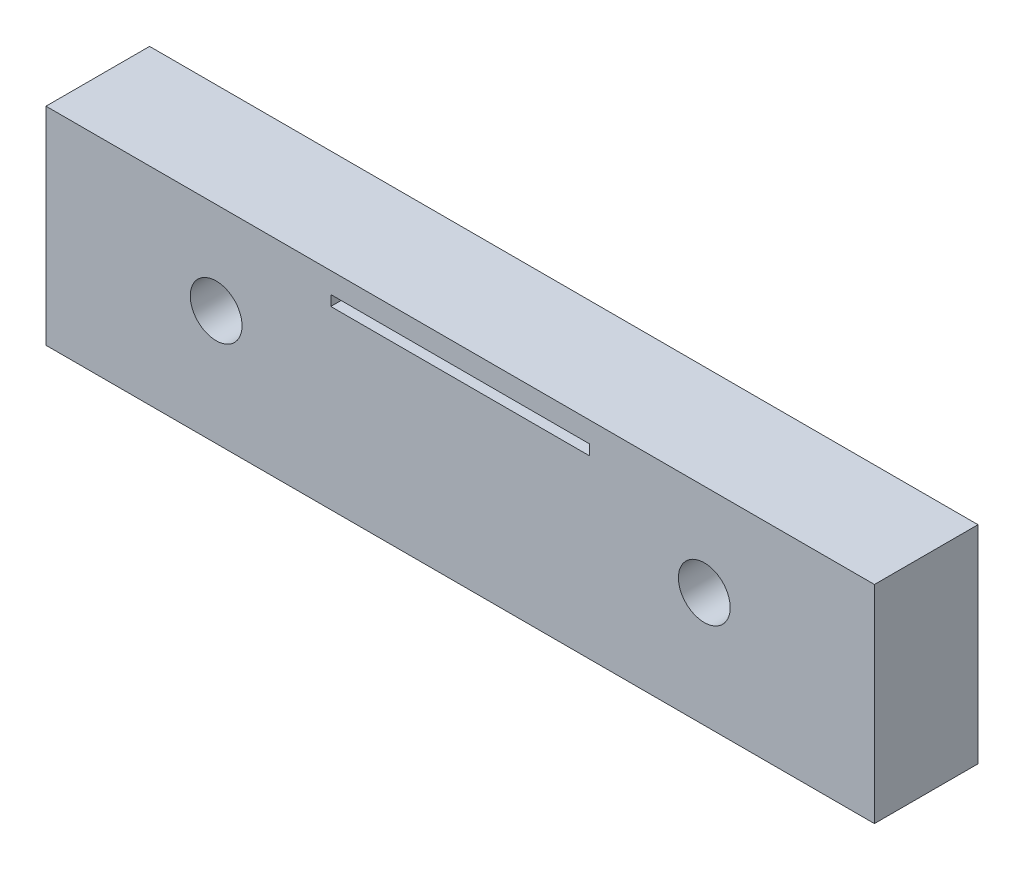
ISO-10303-21;
HEADER;
FILE_DESCRIPTION(('STEP AP214'),'2;1');
FILE_NAME('part.step','',(''),(''),'','','');
FILE_SCHEMA(('AUTOMOTIVE_DESIGN { 1 0 10303 214 1 1 1 1 }'));
ENDSEC;
DATA;
#1=APPLICATION_CONTEXT('core data for automotive mechanical design processes');
#2=APPLICATION_PROTOCOL_DEFINITION('international standard','automotive_design',2000,#1);
#3=PRODUCT_CONTEXT('',#1,'mechanical');
#4=PRODUCT('Part','Part','',(#3));
#5=PRODUCT_RELATED_PRODUCT_CATEGORY('part','',(#4));
#6=PRODUCT_DEFINITION_FORMATION('','',#4);
#7=PRODUCT_DEFINITION_CONTEXT('part definition',#1,'design');
#8=PRODUCT_DEFINITION('design','',#6,#7);
#9=PRODUCT_DEFINITION_SHAPE('','',#8);
#10=(LENGTH_UNIT() NAMED_UNIT(*) SI_UNIT(.MILLI.,.METRE.));
#11=(NAMED_UNIT(*) PLANE_ANGLE_UNIT() SI_UNIT($,.RADIAN.));
#12=(NAMED_UNIT(*) SI_UNIT($,.STERADIAN.) SOLID_ANGLE_UNIT());
#13=UNCERTAINTY_MEASURE_WITH_UNIT(LENGTH_MEASURE(1.E-05),#10,'distance_accuracy_value','');
#14=(GEOMETRIC_REPRESENTATION_CONTEXT(3) GLOBAL_UNCERTAINTY_ASSIGNED_CONTEXT((#13)) GLOBAL_UNIT_ASSIGNED_CONTEXT((#10,
#11,#12)) REPRESENTATION_CONTEXT('',''));
#15=CARTESIAN_POINT('',(0.,0.,0.));
#16=DIRECTION('',(0.,0.,1.));
#17=DIRECTION('',(1.,0.,0.));
#18=AXIS2_PLACEMENT_3D('',#15,#16,#17);
#19=CARTESIAN_POINT('',(-40.3721881525032,21.4849582305706,10.));
#20=DIRECTION('',(1.,0.,0.));
#21=DIRECTION('',(0.,0.,-1.));
#22=AXIS2_PLACEMENT_3D('',#19,#20,#21);
#23=PLANE('',#22);
#24=DIRECTION('',(0.,-1.,0.));
#25=VECTOR('',#24,1.);
#26=CARTESIAN_POINT('',(-40.3721881525032,21.4849582305706,0.));
#27=LINE('',#26,#25);
#28=CARTESIAN_POINT('',(-40.3721881525032,21.4849582305706,0.));
#29=VERTEX_POINT('',#28);
#30=CARTESIAN_POINT('',(-40.3721881525032,1.48495823057057,0.));
#31=VERTEX_POINT('',#30);
#32=EDGE_CURVE('E157',#29,#31,#27,.T.);
#33=ORIENTED_EDGE('',*,*,#32,.T.);
#34=DIRECTION('',(0.,0.,-1.));
#35=VECTOR('',#34,1.);
#36=CARTESIAN_POINT('',(-40.3721881525032,1.48495823057057,10.));
#37=LINE('',#36,#35);
#38=CARTESIAN_POINT('',(-40.3721881525032,1.48495823057057,10.));
#39=VERTEX_POINT('',#38);
#40=EDGE_CURVE('E11',#39,#31,#37,.T.);
#41=ORIENTED_EDGE('',*,*,#40,.F.);
#42=DIRECTION('',(0.,-1.,0.));
#43=VECTOR('',#42,1.);
#44=CARTESIAN_POINT('',(-40.3721881525032,21.4849582305706,10.));
#45=LINE('',#44,#43);
#46=CARTESIAN_POINT('',(-40.3721881525032,21.4849582305706,10.));
#47=VERTEX_POINT('',#46);
#48=EDGE_CURVE('E169',#47,#39,#45,.T.);
#49=ORIENTED_EDGE('',*,*,#48,.F.);
#50=DIRECTION('',(0.,0.,-1.));
#51=VECTOR('',#50,1.);
#52=CARTESIAN_POINT('',(-40.3721881525032,21.4849582305706,10.));
#53=LINE('',#52,#51);
#54=EDGE_CURVE('E183',#47,#29,#53,.T.);
#55=ORIENTED_EDGE('',*,*,#54,.T.);
#56=EDGE_LOOP('',(#33,#41,#49,#55));
#57=FACE_BOUND('',#56,.T.);
#58=ADVANCED_FACE('F39',(#57),#23,.F.);
#59=CARTESIAN_POINT('',(-40.3721881525032,1.48495823057057,10.));
#60=DIRECTION('',(0.,1.,0.));
#61=DIRECTION('',(0.,0.,1.));
#62=AXIS2_PLACEMENT_3D('',#59,#60,#61);
#63=PLANE('',#62);
#64=DIRECTION('',(1.,0.,0.));
#65=VECTOR('',#64,1.);
#66=CARTESIAN_POINT('',(-40.3721881525032,1.48495823057057,0.));
#67=LINE('',#66,#65);
#68=CARTESIAN_POINT('',(39.6278118474968,1.48495823057057,0.));
#69=VERTEX_POINT('',#68);
#70=EDGE_CURVE('E187',#31,#69,#67,.T.);
#71=ORIENTED_EDGE('',*,*,#70,.T.);
#72=DIRECTION('',(0.,0.,-1.));
#73=VECTOR('',#72,1.);
#74=CARTESIAN_POINT('',(39.6278118474968,1.48495823057057,10.));
#75=LINE('',#74,#73);
#76=CARTESIAN_POINT('',(39.6278118474968,1.48495823057057,10.));
#77=VERTEX_POINT('',#76);
#78=EDGE_CURVE('E47',#77,#69,#75,.T.);
#79=ORIENTED_EDGE('',*,*,#78,.F.);
#80=DIRECTION('',(1.,0.,0.));
#81=VECTOR('',#80,1.);
#82=CARTESIAN_POINT('',(-40.3721881525032,1.48495823057057,10.));
#83=LINE('',#82,#81);
#84=EDGE_CURVE('E173',#39,#77,#83,.T.);
#85=ORIENTED_EDGE('',*,*,#84,.F.);
#86=ORIENTED_EDGE('',*,*,#40,.T.);
#87=EDGE_LOOP('',(#71,#79,#85,#86));
#88=FACE_BOUND('',#87,.T.);
#89=ADVANCED_FACE('F222',(#88),#63,.F.);
#90=CARTESIAN_POINT('',(39.6278118474968,21.4849582305706,10.));
#91=DIRECTION('',(-1.,0.,0.));
#92=DIRECTION('',(0.,-1.,0.));
#93=AXIS2_PLACEMENT_3D('',#90,#91,#92);
#94=PLANE('',#93);
#95=DIRECTION('',(0.,1.,0.));
#96=VECTOR('',#95,1.);
#97=CARTESIAN_POINT('',(39.6278118474968,21.4849582305706,0.));
#98=LINE('',#97,#96);
#99=CARTESIAN_POINT('',(39.6278118474968,21.4849582305706,0.));
#100=VERTEX_POINT('',#99);
#101=EDGE_CURVE('E190',#69,#100,#98,.T.);
#102=ORIENTED_EDGE('',*,*,#101,.T.);
#103=DIRECTION('',(0.,0.,-1.));
#104=VECTOR('',#103,1.);
#105=CARTESIAN_POINT('',(39.6278118474968,21.4849582305706,10.));
#106=LINE('',#105,#104);
#107=CARTESIAN_POINT('',(39.6278118474968,21.4849582305706,10.));
#108=VERTEX_POINT('',#107);
#109=EDGE_CURVE('E198',#108,#100,#106,.T.);
#110=ORIENTED_EDGE('',*,*,#109,.F.);
#111=DIRECTION('',(0.,1.,0.));
#112=VECTOR('',#111,1.);
#113=CARTESIAN_POINT('',(39.6278118474968,21.4849582305706,10.));
#114=LINE('',#113,#112);
#115=EDGE_CURVE('E177',#77,#108,#114,.T.);
#116=ORIENTED_EDGE('',*,*,#115,.F.);
#117=ORIENTED_EDGE('',*,*,#78,.T.);
#118=EDGE_LOOP('',(#102,#110,#116,#117));
#119=FACE_BOUND('',#118,.T.);
#120=ADVANCED_FACE('F207',(#119),#94,.F.);
#121=CARTESIAN_POINT('',(-40.3721881525032,21.4849582305706,10.));
#122=DIRECTION('',(0.,-1.,0.));
#123=DIRECTION('',(0.,0.,-1.));
#124=AXIS2_PLACEMENT_3D('',#121,#122,#123);
#125=PLANE('',#124);
#126=DIRECTION('',(-1.,0.,0.));
#127=VECTOR('',#126,1.);
#128=CARTESIAN_POINT('',(-40.3721881525032,21.4849582305706,0.));
#129=LINE('',#128,#127);
#130=EDGE_CURVE('E174',#100,#29,#129,.T.);
#131=ORIENTED_EDGE('',*,*,#130,.T.);
#132=ORIENTED_EDGE('',*,*,#54,.F.);
#133=DIRECTION('',(-1.,0.,0.));
#134=VECTOR('',#133,1.);
#135=CARTESIAN_POINT('',(-40.3721881525032,21.4849582305706,10.));
#136=LINE('',#135,#134);
#137=EDGE_CURVE('E180',#108,#47,#136,.T.);
#138=ORIENTED_EDGE('',*,*,#137,.F.);
#139=ORIENTED_EDGE('',*,*,#109,.T.);
#140=EDGE_LOOP('',(#131,#132,#138,#139));
#141=FACE_BOUND('',#140,.T.);
#142=ADVANCED_FACE('F215',(#141),#125,.F.);
#143=CARTESIAN_POINT('',(0.,0.,10.));
#144=DIRECTION('',(0.,0.,1.));
#145=DIRECTION('',(1.,0.,0.));
#146=AXIS2_PLACEMENT_3D('',#143,#144,#145);
#147=PLANE('',#146);
#148=DIRECTION('',(0.,-1.,0.));
#149=VECTOR('',#148,1.);
#150=CARTESIAN_POINT('',(-12.8721881525032,19.4849582305706,10.));
#151=LINE('',#150,#149);
#152=CARTESIAN_POINT('',(-12.8721881525032,19.4849582305706,10.));
#153=VERTEX_POINT('',#152);
#154=CARTESIAN_POINT('',(-12.8721881525032,18.4849582305706,10.));
#155=VERTEX_POINT('',#154);
#156=EDGE_CURVE('E54',#153,#155,#151,.T.);
#157=ORIENTED_EDGE('',*,*,#156,.F.);
#158=DIRECTION('',(-1.,0.,0.));
#159=VECTOR('',#158,1.);
#160=CARTESIAN_POINT('',(-12.8721881525032,19.4849582305706,10.));
#161=LINE('',#160,#159);
#162=CARTESIAN_POINT('',(12.1278118474968,19.4849582305706,10.));
#163=VERTEX_POINT('',#162);
#164=EDGE_CURVE('E125',#163,#153,#161,.T.);
#165=ORIENTED_EDGE('',*,*,#164,.F.);
#166=DIRECTION('',(0.,1.,0.));
#167=VECTOR('',#166,1.);
#168=CARTESIAN_POINT('',(12.1278118474968,19.4849582305706,10.));
#169=LINE('',#168,#167);
#170=CARTESIAN_POINT('',(12.1278118474968,18.4849582305706,10.));
#171=VERTEX_POINT('',#170);
#172=EDGE_CURVE('E129',#171,#163,#169,.T.);
#173=ORIENTED_EDGE('',*,*,#172,.F.);
#174=DIRECTION('',(1.,0.,0.));
#175=VECTOR('',#174,1.);
#176=CARTESIAN_POINT('',(-12.8721881525032,18.4849582305706,10.));
#177=LINE('',#176,#175);
#178=EDGE_CURVE('E138',#155,#171,#177,.T.);
#179=ORIENTED_EDGE('',*,*,#178,.F.);
#180=EDGE_LOOP('',(#157,#165,#173,#179));
#181=FACE_BOUND('',#180,.T.);
#182=CARTESIAN_POINT('',(-23.9421881525032,12.5849582305706,10.));
#183=DIRECTION('',(0.,0.,1.));
#184=DIRECTION('',(1.,0.,0.));
#185=AXIS2_PLACEMENT_3D('',#182,#183,#184);
#186=CIRCLE('',#185,2.5);
#187=CARTESIAN_POINT('',(-21.4421881525032,12.5849582305706,10.));
#188=VERTEX_POINT('',#187);
#189=EDGE_CURVE('E158',#188,#188,#186,.T.);
#190=ORIENTED_EDGE('',*,*,#189,.F.);
#191=EDGE_LOOP('',(#190));
#192=FACE_BOUND('',#191,.T.);
#193=CARTESIAN_POINT('',(23.1978118474968,12.5849582305706,10.));
#194=DIRECTION('',(0.,0.,1.));
#195=DIRECTION('',(-1.,0.,0.));
#196=AXIS2_PLACEMENT_3D('',#193,#194,#195);
#197=CIRCLE('',#196,2.5);
#198=CARTESIAN_POINT('',(20.6978118474968,12.5849582305706,10.));
#199=VERTEX_POINT('',#198);
#200=EDGE_CURVE('E147',#199,#199,#197,.T.);
#201=ORIENTED_EDGE('',*,*,#200,.F.);
#202=EDGE_LOOP('',(#201));
#203=FACE_BOUND('',#202,.T.);
#204=ORIENTED_EDGE('',*,*,#48,.T.);
#205=ORIENTED_EDGE('',*,*,#84,.T.);
#206=ORIENTED_EDGE('',*,*,#115,.T.);
#207=ORIENTED_EDGE('',*,*,#137,.T.);
#208=EDGE_LOOP('',(#204,#205,#206,#207));
#209=FACE_BOUND('',#208,.T.);
#210=ADVANCED_FACE('F221',(#181,#192,#203,#209),#147,.T.);
#211=CARTESIAN_POINT('',(0.,0.,0.));
#212=DIRECTION('',(0.,0.,1.));
#213=DIRECTION('',(1.,0.,0.));
#214=AXIS2_PLACEMENT_3D('',#211,#212,#213);
#215=PLANE('',#214);
#216=DIRECTION('',(-1.,0.,0.));
#217=VECTOR('',#216,1.);
#218=CARTESIAN_POINT('',(-12.8721881525032,19.4849582305706,0.));
#219=LINE('',#218,#217);
#220=CARTESIAN_POINT('',(12.1278118474968,19.4849582305706,0.));
#221=VERTEX_POINT('',#220);
#222=CARTESIAN_POINT('',(-12.8721881525032,19.4849582305706,0.));
#223=VERTEX_POINT('',#222);
#224=EDGE_CURVE('E113',#221,#223,#219,.T.);
#225=ORIENTED_EDGE('',*,*,#224,.T.);
#226=DIRECTION('',(0.,-1.,0.));
#227=VECTOR('',#226,1.);
#228=CARTESIAN_POINT('',(-12.8721881525032,19.4849582305706,0.));
#229=LINE('',#228,#227);
#230=CARTESIAN_POINT('',(-12.8721881525032,18.4849582305706,0.));
#231=VERTEX_POINT('',#230);
#232=EDGE_CURVE('E106',#223,#231,#229,.T.);
#233=ORIENTED_EDGE('',*,*,#232,.T.);
#234=DIRECTION('',(1.,0.,0.));
#235=VECTOR('',#234,1.);
#236=CARTESIAN_POINT('',(-12.8721881525032,18.4849582305706,0.));
#237=LINE('',#236,#235);
#238=CARTESIAN_POINT('',(12.1278118474968,18.4849582305706,0.));
#239=VERTEX_POINT('',#238);
#240=EDGE_CURVE('E116',#231,#239,#237,.T.);
#241=ORIENTED_EDGE('',*,*,#240,.T.);
#242=DIRECTION('',(0.,1.,0.));
#243=VECTOR('',#242,1.);
#244=CARTESIAN_POINT('',(12.1278118474968,19.4849582305706,0.));
#245=LINE('',#244,#243);
#246=EDGE_CURVE('E62',#239,#221,#245,.T.);
#247=ORIENTED_EDGE('',*,*,#246,.T.);
#248=EDGE_LOOP('',(#225,#233,#241,#247));
#249=FACE_BOUND('',#248,.T.);
#250=CARTESIAN_POINT('',(-23.9421881525032,12.5849582305706,0.));
#251=DIRECTION('',(0.,0.,1.));
#252=DIRECTION('',(1.,0.,0.));
#253=AXIS2_PLACEMENT_3D('',#250,#251,#252);
#254=CIRCLE('',#253,2.5);
#255=CARTESIAN_POINT('',(-21.4421881525032,12.5849582305706,0.));
#256=VERTEX_POINT('',#255);
#257=EDGE_CURVE('E153',#256,#256,#254,.T.);
#258=ORIENTED_EDGE('',*,*,#257,.T.);
#259=EDGE_LOOP('',(#258));
#260=FACE_BOUND('',#259,.T.);
#261=CARTESIAN_POINT('',(23.1978118474968,12.5849582305706,0.));
#262=DIRECTION('',(0.,0.,1.));
#263=DIRECTION('',(-1.,0.,0.));
#264=AXIS2_PLACEMENT_3D('',#261,#262,#263);
#265=CIRCLE('',#264,2.5);
#266=CARTESIAN_POINT('',(20.6978118474968,12.5849582305706,0.));
#267=VERTEX_POINT('',#266);
#268=EDGE_CURVE('E162',#267,#267,#265,.T.);
#269=ORIENTED_EDGE('',*,*,#268,.T.);
#270=EDGE_LOOP('',(#269));
#271=FACE_BOUND('',#270,.T.);
#272=ORIENTED_EDGE('',*,*,#32,.F.);
#273=ORIENTED_EDGE('',*,*,#130,.F.);
#274=ORIENTED_EDGE('',*,*,#101,.F.);
#275=ORIENTED_EDGE('',*,*,#70,.F.);
#276=EDGE_LOOP('',(#272,#273,#274,#275));
#277=FACE_BOUND('',#276,.T.);
#278=ADVANCED_FACE('F121',(#249,#260,#271,#277),#215,.F.);
#279=CARTESIAN_POINT('',(23.1978118474968,12.5849582305706,0.));
#280=DIRECTION('',(0.,0.,1.));
#281=DIRECTION('',(1.,0.,0.));
#282=AXIS2_PLACEMENT_3D('',#279,#280,#281);
#283=CYLINDRICAL_SURFACE('',#282,2.5);
#284=ORIENTED_EDGE('',*,*,#268,.F.);
#285=EDGE_LOOP('',(#284));
#286=FACE_BOUND('',#285,.T.);
#287=ORIENTED_EDGE('',*,*,#200,.T.);
#288=EDGE_LOOP('',(#287));
#289=FACE_BOUND('',#288,.T.);
#290=ADVANCED_FACE('F234',(#286,#289),#283,.F.);
#291=CARTESIAN_POINT('',(-23.9421881525032,12.5849582305706,0.));
#292=DIRECTION('',(0.,0.,1.));
#293=DIRECTION('',(1.,0.,0.));
#294=AXIS2_PLACEMENT_3D('',#291,#292,#293);
#295=CYLINDRICAL_SURFACE('',#294,2.5);
#296=ORIENTED_EDGE('',*,*,#257,.F.);
#297=EDGE_LOOP('',(#296));
#298=FACE_BOUND('',#297,.T.);
#299=ORIENTED_EDGE('',*,*,#189,.T.);
#300=EDGE_LOOP('',(#299));
#301=FACE_BOUND('',#300,.T.);
#302=ADVANCED_FACE('F240',(#298,#301),#295,.F.);
#303=CARTESIAN_POINT('',(-12.8721881525032,19.4849582305706,0.));
#304=DIRECTION('',(-1.,0.,0.));
#305=DIRECTION('',(0.,0.,1.));
#306=AXIS2_PLACEMENT_3D('',#303,#304,#305);
#307=PLANE('',#306);
#308=ORIENTED_EDGE('',*,*,#156,.T.);
#309=DIRECTION('',(0.,0.,1.));
#310=VECTOR('',#309,1.);
#311=CARTESIAN_POINT('',(-12.8721881525032,18.4849582305706,0.));
#312=LINE('',#311,#310);
#313=EDGE_CURVE('E102',#231,#155,#312,.T.);
#314=ORIENTED_EDGE('',*,*,#313,.F.);
#315=ORIENTED_EDGE('',*,*,#232,.F.);
#316=DIRECTION('',(0.,0.,1.));
#317=VECTOR('',#316,1.);
#318=CARTESIAN_POINT('',(-12.8721881525032,19.4849582305706,0.));
#319=LINE('',#318,#317);
#320=EDGE_CURVE('E144',#223,#153,#319,.T.);
#321=ORIENTED_EDGE('',*,*,#320,.T.);
#322=EDGE_LOOP('',(#308,#314,#315,#321));
#323=FACE_BOUND('',#322,.T.);
#324=ADVANCED_FACE('F104',(#323),#307,.F.);
#325=CARTESIAN_POINT('',(-12.8721881525032,19.4849582305706,0.));
#326=DIRECTION('',(0.,1.,0.));
#327=DIRECTION('',(0.,0.,1.));
#328=AXIS2_PLACEMENT_3D('',#325,#326,#327);
#329=PLANE('',#328);
#330=ORIENTED_EDGE('',*,*,#164,.T.);
#331=ORIENTED_EDGE('',*,*,#320,.F.);
#332=ORIENTED_EDGE('',*,*,#224,.F.);
#333=DIRECTION('',(0.,0.,1.));
#334=VECTOR('',#333,1.);
#335=CARTESIAN_POINT('',(12.1278118474968,19.4849582305706,0.));
#336=LINE('',#335,#334);
#337=EDGE_CURVE('E148',#221,#163,#336,.T.);
#338=ORIENTED_EDGE('',*,*,#337,.T.);
#339=EDGE_LOOP('',(#330,#331,#332,#338));
#340=FACE_BOUND('',#339,.T.);
#341=ADVANCED_FACE('F247',(#340),#329,.F.);
#342=CARTESIAN_POINT('',(12.1278118474968,19.4849582305706,0.));
#343=DIRECTION('',(1.,0.,0.));
#344=DIRECTION('',(0.,0.,-1.));
#345=AXIS2_PLACEMENT_3D('',#342,#343,#344);
#346=PLANE('',#345);
#347=ORIENTED_EDGE('',*,*,#172,.T.);
#348=ORIENTED_EDGE('',*,*,#337,.F.);
#349=ORIENTED_EDGE('',*,*,#246,.F.);
#350=DIRECTION('',(0.,0.,1.));
#351=VECTOR('',#350,1.);
#352=CARTESIAN_POINT('',(12.1278118474968,18.4849582305706,0.));
#353=LINE('',#352,#351);
#354=EDGE_CURVE('E112',#239,#171,#353,.T.);
#355=ORIENTED_EDGE('',*,*,#354,.T.);
#356=EDGE_LOOP('',(#347,#348,#349,#355));
#357=FACE_BOUND('',#356,.T.);
#358=ADVANCED_FACE('F250',(#357),#346,.F.);
#359=CARTESIAN_POINT('',(-12.8721881525032,18.4849582305706,0.));
#360=DIRECTION('',(0.,-1.,0.));
#361=DIRECTION('',(0.,0.,-1.));
#362=AXIS2_PLACEMENT_3D('',#359,#360,#361);
#363=PLANE('',#362);
#364=ORIENTED_EDGE('',*,*,#178,.T.);
#365=ORIENTED_EDGE('',*,*,#354,.F.);
#366=ORIENTED_EDGE('',*,*,#240,.F.);
#367=ORIENTED_EDGE('',*,*,#313,.T.);
#368=EDGE_LOOP('',(#364,#365,#366,#367));
#369=FACE_BOUND('',#368,.T.);
#370=ADVANCED_FACE('F117',(#369),#363,.F.);
#371=CLOSED_SHELL('',(#58,#89,#120,#142,#210,#278,#290,#302,#324,#341,#358,#370));
#372=MANIFOLD_SOLID_BREP('B2',#371);
#373=ADVANCED_BREP_SHAPE_REPRESENTATION('',(#18,#372),#14);
#374=SHAPE_DEFINITION_REPRESENTATION(#9,#373);
ENDSEC;
END-ISO-10303-21;
